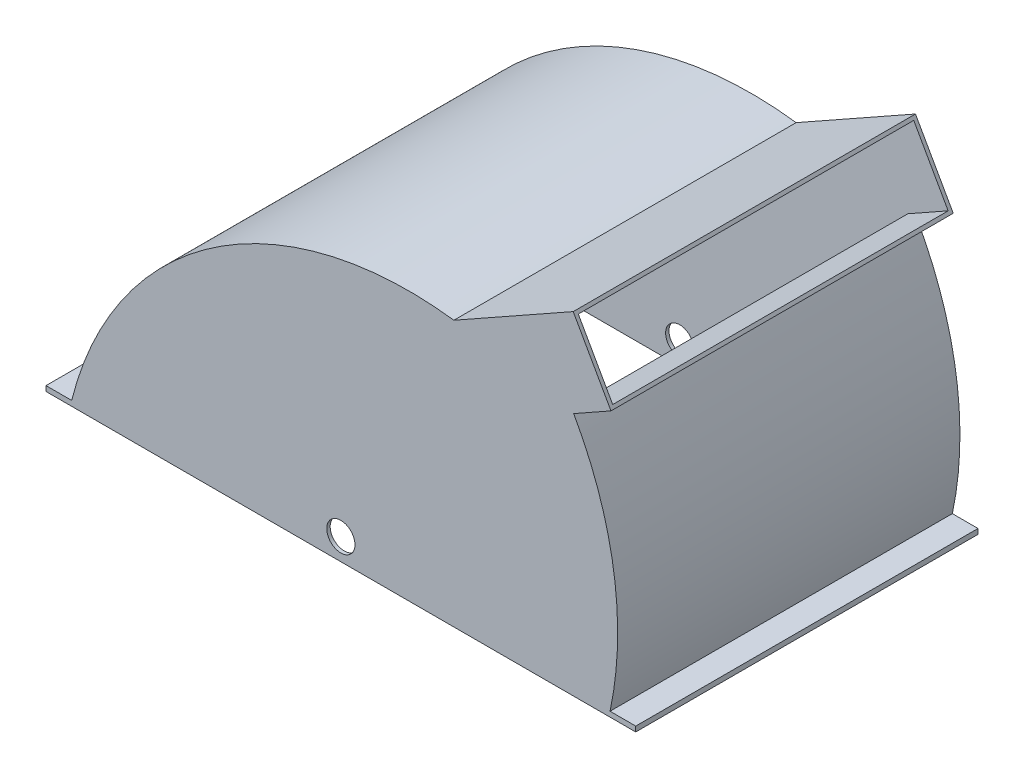
ISO-10303-21;
HEADER;
FILE_DESCRIPTION(('STEP AP214'),'2;1');
FILE_NAME('part.step','',(''),(''),'','','');
FILE_SCHEMA(('AUTOMOTIVE_DESIGN { 1 0 10303 214 1 1 1 1 }'));
ENDSEC;
DATA;
#1=APPLICATION_CONTEXT('core data for automotive mechanical design processes');
#2=APPLICATION_PROTOCOL_DEFINITION('international standard','automotive_design',2000,#1);
#3=PRODUCT_CONTEXT('',#1,'mechanical');
#4=PRODUCT('Part','Part','',(#3));
#5=PRODUCT_RELATED_PRODUCT_CATEGORY('part','',(#4));
#6=PRODUCT_DEFINITION_FORMATION('','',#4);
#7=PRODUCT_DEFINITION_CONTEXT('part definition',#1,'design');
#8=PRODUCT_DEFINITION('design','',#6,#7);
#9=PRODUCT_DEFINITION_SHAPE('','',#8);
#10=(LENGTH_UNIT() NAMED_UNIT(*) SI_UNIT(.MILLI.,.METRE.));
#11=(NAMED_UNIT(*) PLANE_ANGLE_UNIT() SI_UNIT($,.RADIAN.));
#12=(NAMED_UNIT(*) SI_UNIT($,.STERADIAN.) SOLID_ANGLE_UNIT());
#13=UNCERTAINTY_MEASURE_WITH_UNIT(LENGTH_MEASURE(1.E-05),#10,'distance_accuracy_value','');
#14=(GEOMETRIC_REPRESENTATION_CONTEXT(3) GLOBAL_UNCERTAINTY_ASSIGNED_CONTEXT((#13)) GLOBAL_UNIT_ASSIGNED_CONTEXT((#10,
#11,#12)) REPRESENTATION_CONTEXT('',''));
#15=CARTESIAN_POINT('',(0.,0.,0.));
#16=DIRECTION('',(0.,0.,1.));
#17=DIRECTION('',(1.,0.,0.));
#18=AXIS2_PLACEMENT_3D('',#15,#16,#17);
#19=CARTESIAN_POINT('',(39.841724248667,-49.2583214954355,98.));
#20=DIRECTION('',(0.,0.,1.));
#21=DIRECTION('',(1.,0.,0.));
#22=AXIS2_PLACEMENT_3D('',#19,#20,#21);
#23=PLANE('',#22);
#24=CARTESIAN_POINT('',(6.07568708894432E-13,9.69266385878526,98.));
#25=DIRECTION('',(0.,0.,1.));
#26=DIRECTION('',(1.,0.,0.));
#27=AXIS2_PLACEMENT_3D('',#24,#25,#26);
#28=CIRCLE('',#27,8.25);
#29=CARTESIAN_POINT('',(8.25000000000061,9.69266385878526,98.));
#30=VERTEX_POINT('',#29);
#31=EDGE_CURVE('E311',#30,#30,#28,.T.);
#32=ORIENTED_EDGE('',*,*,#31,.T.);
#33=EDGE_LOOP('',(#32));
#34=FACE_BOUND('',#33,.T.);
#35=DIRECTION('',(0.,1.,0.));
#36=VECTOR('',#35,1.);
#37=CARTESIAN_POINT('',(154.809922153854,-199.611145441147,98.));
#38=LINE('',#37,#36);
#39=CARTESIAN_POINT('',(154.809922153854,-3.,98.));
#40=VERTEX_POINT('',#39);
#41=CARTESIAN_POINT('',(154.809922153854,-2.00000000000001,98.));
#42=VERTEX_POINT('',#41);
#43=EDGE_CURVE('E59',#40,#42,#38,.T.);
#44=ORIENTED_EDGE('',*,*,#43,.F.);
#45=DIRECTION('',(1.,0.,0.));
#46=VECTOR('',#45,1.);
#47=CARTESIAN_POINT('',(-172.3,-3.,98.));
#48=LINE('',#47,#46);
#49=CARTESIAN_POINT('',(-155.732003196408,-3.,98.));
#50=VERTEX_POINT('',#49);
#51=EDGE_CURVE('E191',#50,#40,#48,.T.);
#52=ORIENTED_EDGE('',*,*,#51,.F.);
#53=DIRECTION('',(0.,1.,0.));
#54=VECTOR('',#53,1.);
#55=CARTESIAN_POINT('',(-155.732003196408,-199.611145441146,98.));
#56=LINE('',#55,#54);
#57=CARTESIAN_POINT('',(-155.732003196408,-2.00000000000001,98.));
#58=VERTEX_POINT('',#57);
#59=EDGE_CURVE('E306',#50,#58,#56,.T.);
#60=ORIENTED_EDGE('',*,*,#59,.T.);
#61=CARTESIAN_POINT('',(39.841724248667,-49.2583214954355,98.));
#62=DIRECTION('',(0.,0.,1.));
#63=DIRECTION('',(1.,0.,0.));
#64=AXIS2_PLACEMENT_3D('',#61,#62,#63);
#65=CIRCLE('',#64,201.202464739691);
#66=CARTESIAN_POINT('',(66.4458023419847,150.177519932657,98.));
#67=VERTEX_POINT('',#66);
#68=EDGE_CURVE('E188',#67,#58,#65,.T.);
#69=ORIENTED_EDGE('',*,*,#68,.F.);
#70=DIRECTION('',(-0.871511919232912,-0.490374320937552,0.));
#71=VECTOR('',#70,1.);
#72=CARTESIAN_POINT('',(67.0267902565978,150.504424875451,98.));
#73=LINE('',#72,#71);
#74=CARTESIAN_POINT('',(136.747743795231,189.734370550455,98.));
#75=VERTEX_POINT('',#74);
#76=EDGE_CURVE('E193',#75,#67,#73,.T.);
#77=ORIENTED_EDGE('',*,*,#76,.F.);
#78=DIRECTION('',(0.490374320937552,-0.871511919232913,0.));
#79=VECTOR('',#78,1.);
#80=CARTESIAN_POINT('',(135.766995153356,191.477394388921,98.));
#81=LINE('',#80,#79);
#82=CARTESIAN_POINT('',(156.853090953671,154.002381861905,98.));
#83=VERTEX_POINT('',#82);
#84=EDGE_CURVE('E280',#75,#83,#81,.T.);
#85=ORIENTED_EDGE('',*,*,#84,.T.);
#86=DIRECTION('',(0.871511919232892,0.490374320937588,0.));
#87=VECTOR('',#86,1.);
#88=CARTESIAN_POINT('',(156.85309095367,154.002381861906,98.));
#89=LINE('',#88,#87);
#90=CARTESIAN_POINT('',(133.313465759124,140.757321794269,98.));
#91=VERTEX_POINT('',#90);
#92=EDGE_CURVE('E195',#91,#83,#89,.T.);
#93=ORIENTED_EDGE('',*,*,#92,.F.);
#94=CARTESIAN_POINT('',(-38.2563422318594,41.9251358124896,98.));
#95=DIRECTION('',(0.,0.,1.));
#96=DIRECTION('',(1.,0.,0.));
#97=AXIS2_PLACEMENT_3D('',#94,#95,#96);
#98=CIRCLE('',#97,198.);
#99=EDGE_CURVE('E187',#42,#91,#98,.T.);
#100=ORIENTED_EDGE('',*,*,#99,.F.);
#101=EDGE_LOOP('',(#44,#52,#60,#69,#77,#85,#93,#100));
#102=FACE_BOUND('',#101,.T.);
#103=ADVANCED_FACE('F35',(#34,#102),#23,.F.);
#104=CARTESIAN_POINT('',(39.841724248667,-49.2583214954355,-98.));
#105=DIRECTION('',(0.,0.,1.));
#106=DIRECTION('',(1.,0.,0.));
#107=AXIS2_PLACEMENT_3D('',#104,#105,#106);
#108=PLANE('',#107);
#109=CARTESIAN_POINT('',(6.07568708894432E-13,9.69266385878526,-98.));
#110=DIRECTION('',(0.,0.,1.));
#111=DIRECTION('',(1.,0.,0.));
#112=AXIS2_PLACEMENT_3D('',#109,#110,#111);
#113=CIRCLE('',#112,8.25);
#114=CARTESIAN_POINT('',(8.25000000000061,9.69266385878526,-98.));
#115=VERTEX_POINT('',#114);
#116=EDGE_CURVE('E315',#115,#115,#113,.T.);
#117=ORIENTED_EDGE('',*,*,#116,.F.);
#118=EDGE_LOOP('',(#117));
#119=FACE_BOUND('',#118,.T.);
#120=DIRECTION('',(1.,0.,0.));
#121=VECTOR('',#120,1.);
#122=CARTESIAN_POINT('',(-172.3,-3.,-98.));
#123=LINE('',#122,#121);
#124=CARTESIAN_POINT('',(-155.732003196408,-3.,-98.));
#125=VERTEX_POINT('',#124);
#126=CARTESIAN_POINT('',(154.809922153854,-3.,-98.));
#127=VERTEX_POINT('',#126);
#128=EDGE_CURVE('E51',#125,#127,#123,.T.);
#129=ORIENTED_EDGE('',*,*,#128,.T.);
#130=DIRECTION('',(0.,1.,0.));
#131=VECTOR('',#130,1.);
#132=CARTESIAN_POINT('',(154.809922153854,-199.611145441147,-98.));
#133=LINE('',#132,#131);
#134=CARTESIAN_POINT('',(154.809922153854,-2.00000000000017,-98.));
#135=VERTEX_POINT('',#134);
#136=EDGE_CURVE('E172',#127,#135,#133,.T.);
#137=ORIENTED_EDGE('',*,*,#136,.T.);
#138=CARTESIAN_POINT('',(-38.2563422318594,41.9251358124896,-98.));
#139=DIRECTION('',(0.,0.,1.));
#140=DIRECTION('',(1.,0.,0.));
#141=AXIS2_PLACEMENT_3D('',#138,#139,#140);
#142=CIRCLE('',#141,198.);
#143=CARTESIAN_POINT('',(133.313465759124,140.757321794269,-98.));
#144=VERTEX_POINT('',#143);
#145=EDGE_CURVE('E162',#135,#144,#142,.T.);
#146=ORIENTED_EDGE('',*,*,#145,.T.);
#147=DIRECTION('',(0.871511919232892,0.490374320937588,0.));
#148=VECTOR('',#147,1.);
#149=CARTESIAN_POINT('',(156.85309095367,154.002381861906,-98.));
#150=LINE('',#149,#148);
#151=CARTESIAN_POINT('',(156.853090953671,154.002381861905,-98.));
#152=VERTEX_POINT('',#151);
#153=EDGE_CURVE('E169',#144,#152,#150,.T.);
#154=ORIENTED_EDGE('',*,*,#153,.T.);
#155=DIRECTION('',(-0.490374320937552,0.871511919232913,0.));
#156=VECTOR('',#155,1.);
#157=CARTESIAN_POINT('',(135.766995153356,191.477394388921,-98.));
#158=LINE('',#157,#156);
#159=CARTESIAN_POINT('',(136.747743795231,189.734370550455,-98.));
#160=VERTEX_POINT('',#159);
#161=EDGE_CURVE('E11',#152,#160,#158,.T.);
#162=ORIENTED_EDGE('',*,*,#161,.T.);
#163=DIRECTION('',(-0.871511919232912,-0.490374320937552,0.));
#164=VECTOR('',#163,1.);
#165=CARTESIAN_POINT('',(67.0267902565978,150.504424875451,-98.));
#166=LINE('',#165,#164);
#167=CARTESIAN_POINT('',(66.4458023419847,150.177519932657,-98.));
#168=VERTEX_POINT('',#167);
#169=EDGE_CURVE('E192',#160,#168,#166,.T.);
#170=ORIENTED_EDGE('',*,*,#169,.T.);
#171=CARTESIAN_POINT('',(39.841724248667,-49.2583214954355,-98.));
#172=DIRECTION('',(0.,0.,1.));
#173=DIRECTION('',(1.,0.,0.));
#174=AXIS2_PLACEMENT_3D('',#171,#172,#173);
#175=CIRCLE('',#174,201.202464739691);
#176=CARTESIAN_POINT('',(-155.732003196408,-2.00000000000001,-98.));
#177=VERTEX_POINT('',#176);
#178=EDGE_CURVE('E196',#168,#177,#175,.T.);
#179=ORIENTED_EDGE('',*,*,#178,.T.);
#180=DIRECTION('',(0.,1.,0.));
#181=VECTOR('',#180,1.);
#182=CARTESIAN_POINT('',(-155.732003196408,-199.611145441146,-98.));
#183=LINE('',#182,#181);
#184=EDGE_CURVE('E303',#125,#177,#183,.T.);
#185=ORIENTED_EDGE('',*,*,#184,.F.);
#186=EDGE_LOOP('',(#129,#137,#146,#154,#162,#170,#179,#185));
#187=FACE_BOUND('',#186,.T.);
#188=ADVANCED_FACE('F173',(#119,#187),#108,.T.);
#189=CARTESIAN_POINT('',(-172.3,-3.,100.));
#190=DIRECTION('',(0.,1.,0.));
#191=DIRECTION('',(0.,0.,1.));
#192=AXIS2_PLACEMENT_3D('',#189,#190,#191);
#193=PLANE('',#192);
#194=DIRECTION('',(0.,0.,1.));
#195=VECTOR('',#194,1.);
#196=CARTESIAN_POINT('',(154.809922153854,-3.,98.));
#197=LINE('',#196,#195);
#198=EDGE_CURVE('E176',#127,#40,#197,.T.);
#199=ORIENTED_EDGE('',*,*,#198,.F.);
#200=ORIENTED_EDGE('',*,*,#128,.F.);
#201=DIRECTION('',(0.,0.,-1.));
#202=VECTOR('',#201,1.);
#203=CARTESIAN_POINT('',(-155.732003196408,-3.,-98.));
#204=LINE('',#203,#202);
#205=EDGE_CURVE('E198',#50,#125,#204,.T.);
#206=ORIENTED_EDGE('',*,*,#205,.F.);
#207=ORIENTED_EDGE('',*,*,#51,.T.);
#208=EDGE_LOOP('',(#199,#200,#206,#207));
#209=FACE_BOUND('',#208,.T.);
#210=DIRECTION('',(1.,0.,0.));
#211=VECTOR('',#210,1.);
#212=CARTESIAN_POINT('',(-172.3,-3.,-100.));
#213=LINE('',#212,#211);
#214=CARTESIAN_POINT('',(-172.3,-3.,-100.));
#215=VERTEX_POINT('',#214);
#216=CARTESIAN_POINT('',(172.3,-3.,-100.));
#217=VERTEX_POINT('',#216);
#218=EDGE_CURVE('E234',#215,#217,#213,.T.);
#219=ORIENTED_EDGE('',*,*,#218,.T.);
#220=DIRECTION('',(0.,0.,-1.));
#221=VECTOR('',#220,1.);
#222=CARTESIAN_POINT('',(172.3,-3.,100.));
#223=LINE('',#222,#221);
#224=CARTESIAN_POINT('',(172.3,-3.,100.));
#225=VERTEX_POINT('',#224);
#226=EDGE_CURVE('E264',#225,#217,#223,.T.);
#227=ORIENTED_EDGE('',*,*,#226,.F.);
#228=DIRECTION('',(1.,0.,0.));
#229=VECTOR('',#228,1.);
#230=CARTESIAN_POINT('',(-172.3,-3.,100.));
#231=LINE('',#230,#229);
#232=CARTESIAN_POINT('',(-172.3,-3.,100.));
#233=VERTEX_POINT('',#232);
#234=EDGE_CURVE('E213',#233,#225,#231,.T.);
#235=ORIENTED_EDGE('',*,*,#234,.F.);
#236=DIRECTION('',(0.,0.,-1.));
#237=VECTOR('',#236,1.);
#238=CARTESIAN_POINT('',(-172.3,-3.,100.));
#239=LINE('',#238,#237);
#240=EDGE_CURVE('E267',#233,#215,#239,.T.);
#241=ORIENTED_EDGE('',*,*,#240,.T.);
#242=EDGE_LOOP('',(#219,#227,#235,#241));
#243=FACE_BOUND('',#242,.T.);
#244=ADVANCED_FACE('F347',(#209,#243),#193,.F.);
#245=CARTESIAN_POINT('',(135.766995153356,191.477394388921,100.));
#246=DIRECTION('',(-0.871511919232912,-0.490374320937552,0.));
#247=DIRECTION('',(0.490374320937552,-0.871511919232913,0.));
#248=AXIS2_PLACEMENT_3D('',#245,#246,#247);
#249=PLANE('',#248);
#250=DIRECTION('',(-0.490374320937552,0.871511919232912,0.));
#251=VECTOR('',#250,1.);
#252=CARTESIAN_POINT('',(135.766995153356,191.477394388921,-100.));
#253=LINE('',#252,#251);
#254=CARTESIAN_POINT('',(157.833839595546,152.25935802344,-100.));
#255=VERTEX_POINT('',#254);
#256=CARTESIAN_POINT('',(135.766995153356,191.477394388921,-100.));
#257=VERTEX_POINT('',#256);
#258=EDGE_CURVE('E244',#255,#257,#253,.T.);
#259=ORIENTED_EDGE('',*,*,#258,.T.);
#260=DIRECTION('',(0.,0.,-1.));
#261=VECTOR('',#260,1.);
#262=CARTESIAN_POINT('',(135.766995153356,191.477394388921,100.));
#263=LINE('',#262,#261);
#264=CARTESIAN_POINT('',(135.766995153356,191.477394388921,100.));
#265=VERTEX_POINT('',#264);
#266=EDGE_CURVE('E249',#265,#257,#263,.T.);
#267=ORIENTED_EDGE('',*,*,#266,.F.);
#268=DIRECTION('',(-0.490374320937552,0.871511919232912,0.));
#269=VECTOR('',#268,1.);
#270=CARTESIAN_POINT('',(135.766995153356,191.477394388921,100.));
#271=LINE('',#270,#269);
#272=CARTESIAN_POINT('',(157.833839595546,152.25935802344,100.));
#273=VERTEX_POINT('',#272);
#274=EDGE_CURVE('E223',#273,#265,#271,.T.);
#275=ORIENTED_EDGE('',*,*,#274,.F.);
#276=DIRECTION('',(0.,0.,-1.));
#277=VECTOR('',#276,1.);
#278=CARTESIAN_POINT('',(157.833839595546,152.25935802344,100.));
#279=LINE('',#278,#277);
#280=EDGE_CURVE('E252',#273,#255,#279,.T.);
#281=ORIENTED_EDGE('',*,*,#280,.T.);
#282=EDGE_LOOP('',(#259,#267,#275,#281));
#283=FACE_BOUND('',#282,.T.);
#284=ORIENTED_EDGE('',*,*,#161,.F.);
#285=DIRECTION('',(0.,0.,-1.));
#286=VECTOR('',#285,1.);
#287=CARTESIAN_POINT('',(156.853090953671,154.002381861905,100.));
#288=LINE('',#287,#286);
#289=EDGE_CURVE('E276',#83,#152,#288,.T.);
#290=ORIENTED_EDGE('',*,*,#289,.F.);
#291=ORIENTED_EDGE('',*,*,#84,.F.);
#292=DIRECTION('',(0.,0.,1.));
#293=VECTOR('',#292,1.);
#294=CARTESIAN_POINT('',(136.747743795231,189.734370550455,100.));
#295=LINE('',#294,#293);
#296=EDGE_CURVE('E44',#160,#75,#295,.T.);
#297=ORIENTED_EDGE('',*,*,#296,.F.);
#298=EDGE_LOOP('',(#284,#290,#291,#297));
#299=FACE_BOUND('',#298,.T.);
#300=ADVANCED_FACE('F297',(#283,#299),#249,.F.);
#301=CARTESIAN_POINT('',(39.841724248667,-49.2583214954355,100.));
#302=DIRECTION('',(0.,0.,-1.));
#303=DIRECTION('',(-1.,0.,0.));
#304=AXIS2_PLACEMENT_3D('',#301,#302,#303);
#305=CYLINDRICAL_SURFACE('',#304,203.202464739691);
#306=CARTESIAN_POINT('',(39.841724248667,-49.2583214954355,-100.));
#307=DIRECTION('',(0.,0.,1.));
#308=DIRECTION('',(1.,0.,0.));
#309=AXIS2_PLACEMENT_3D('',#306,#307,#308);
#310=CIRCLE('',#309,203.202464739691);
#311=CARTESIAN_POINT('',(66.0460416147227,152.247448713917,-100.));
#312=VERTEX_POINT('',#311);
#313=CARTESIAN_POINT('',(-157.3,0.,-100.));
#314=VERTEX_POINT('',#313);
#315=EDGE_CURVE('E181',#312,#314,#310,.T.);
#316=ORIENTED_EDGE('',*,*,#315,.T.);
#317=DIRECTION('',(0.,0.,-1.));
#318=VECTOR('',#317,1.);
#319=CARTESIAN_POINT('',(-157.3,0.,100.));
#320=LINE('',#319,#318);
#321=CARTESIAN_POINT('',(-157.3,0.,100.));
#322=VERTEX_POINT('',#321);
#323=EDGE_CURVE('E273',#322,#314,#320,.T.);
#324=ORIENTED_EDGE('',*,*,#323,.F.);
#325=CARTESIAN_POINT('',(39.841724248667,-49.2583214954355,100.));
#326=DIRECTION('',(0.,0.,1.));
#327=DIRECTION('',(1.,0.,0.));
#328=AXIS2_PLACEMENT_3D('',#325,#326,#327);
#329=CIRCLE('',#328,203.202464739691);
#330=CARTESIAN_POINT('',(66.0460416147227,152.247448713917,100.));
#331=VERTEX_POINT('',#330);
#332=EDGE_CURVE('E205',#331,#322,#329,.T.);
#333=ORIENTED_EDGE('',*,*,#332,.F.);
#334=DIRECTION('',(0.,0.,-1.));
#335=VECTOR('',#334,1.);
#336=CARTESIAN_POINT('',(66.0460416147227,152.247448713917,100.));
#337=LINE('',#336,#335);
#338=EDGE_CURVE('E227',#331,#312,#337,.T.);
#339=ORIENTED_EDGE('',*,*,#338,.T.);
#340=EDGE_LOOP('',(#316,#324,#333,#339));
#341=FACE_BOUND('',#340,.T.);
#342=ADVANCED_FACE('F37',(#341),#305,.T.);
#343=CARTESIAN_POINT('',(-157.3,0.,100.));
#344=DIRECTION('',(0.,-1.,0.));
#345=DIRECTION('',(1.,0.,0.));
#346=AXIS2_PLACEMENT_3D('',#343,#344,#345);
#347=PLANE('',#346);
#348=DIRECTION('',(-1.,0.,0.));
#349=VECTOR('',#348,1.);
#350=CARTESIAN_POINT('',(-157.3,0.,-100.));
#351=LINE('',#350,#349);
#352=CARTESIAN_POINT('',(-172.3,0.,-100.));
#353=VERTEX_POINT('',#352);
#354=EDGE_CURVE('E230',#314,#353,#351,.T.);
#355=ORIENTED_EDGE('',*,*,#354,.T.);
#356=DIRECTION('',(0.,0.,-1.));
#357=VECTOR('',#356,1.);
#358=CARTESIAN_POINT('',(-172.3,0.,100.));
#359=LINE('',#358,#357);
#360=CARTESIAN_POINT('',(-172.3,0.,100.));
#361=VERTEX_POINT('',#360);
#362=EDGE_CURVE('E270',#361,#353,#359,.T.);
#363=ORIENTED_EDGE('',*,*,#362,.F.);
#364=DIRECTION('',(-1.,0.,0.));
#365=VECTOR('',#364,1.);
#366=CARTESIAN_POINT('',(-157.3,0.,100.));
#367=LINE('',#366,#365);
#368=EDGE_CURVE('E208',#322,#361,#367,.T.);
#369=ORIENTED_EDGE('',*,*,#368,.F.);
#370=ORIENTED_EDGE('',*,*,#323,.T.);
#371=EDGE_LOOP('',(#355,#363,#369,#370));
#372=FACE_BOUND('',#371,.T.);
#373=ADVANCED_FACE('F388',(#372),#347,.F.);
#374=CARTESIAN_POINT('',(-172.3,0.,100.));
#375=DIRECTION('',(1.,0.,0.));
#376=DIRECTION('',(0.,0.,-1.));
#377=AXIS2_PLACEMENT_3D('',#374,#375,#376);
#378=PLANE('',#377);
#379=DIRECTION('',(0.,-1.,0.));
#380=VECTOR('',#379,1.);
#381=CARTESIAN_POINT('',(-172.3,0.,-100.));
#382=LINE('',#381,#380);
#383=EDGE_CURVE('E232',#353,#215,#382,.T.);
#384=ORIENTED_EDGE('',*,*,#383,.T.);
#385=ORIENTED_EDGE('',*,*,#240,.F.);
#386=DIRECTION('',(0.,-1.,0.));
#387=VECTOR('',#386,1.);
#388=CARTESIAN_POINT('',(-172.3,0.,100.));
#389=LINE('',#388,#387);
#390=EDGE_CURVE('E211',#361,#233,#389,.T.);
#391=ORIENTED_EDGE('',*,*,#390,.F.);
#392=ORIENTED_EDGE('',*,*,#362,.T.);
#393=EDGE_LOOP('',(#384,#385,#391,#392));
#394=FACE_BOUND('',#393,.T.);
#395=ADVANCED_FACE('F382',(#394),#378,.F.);
#396=CARTESIAN_POINT('',(172.3,-3.,100.));
#397=DIRECTION('',(-1.,0.,0.));
#398=DIRECTION('',(0.,0.,1.));
#399=AXIS2_PLACEMENT_3D('',#396,#397,#398);
#400=PLANE('',#399);
#401=DIRECTION('',(0.,1.,0.));
#402=VECTOR('',#401,1.);
#403=CARTESIAN_POINT('',(172.3,-3.,-100.));
#404=LINE('',#403,#402);
#405=CARTESIAN_POINT('',(172.3,0.,-100.));
#406=VERTEX_POINT('',#405);
#407=EDGE_CURVE('E236',#217,#406,#404,.T.);
#408=ORIENTED_EDGE('',*,*,#407,.T.);
#409=DIRECTION('',(0.,0.,-1.));
#410=VECTOR('',#409,1.);
#411=CARTESIAN_POINT('',(172.3,0.,100.));
#412=LINE('',#411,#410);
#413=CARTESIAN_POINT('',(172.3,0.,100.));
#414=VERTEX_POINT('',#413);
#415=EDGE_CURVE('E261',#414,#406,#412,.T.);
#416=ORIENTED_EDGE('',*,*,#415,.F.);
#417=DIRECTION('',(0.,1.,0.));
#418=VECTOR('',#417,1.);
#419=CARTESIAN_POINT('',(172.3,-3.,100.));
#420=LINE('',#419,#418);
#421=EDGE_CURVE('E215',#225,#414,#420,.T.);
#422=ORIENTED_EDGE('',*,*,#421,.F.);
#423=ORIENTED_EDGE('',*,*,#226,.T.);
#424=EDGE_LOOP('',(#408,#416,#422,#423));
#425=FACE_BOUND('',#424,.T.);
#426=ADVANCED_FACE('F378',(#425),#400,.F.);
#427=CARTESIAN_POINT('',(157.3,0.,100.));
#428=DIRECTION('',(0.,-1.,0.));
#429=DIRECTION('',(1.,0.,0.));
#430=AXIS2_PLACEMENT_3D('',#427,#428,#429);
#431=PLANE('',#430);
#432=DIRECTION('',(-1.,0.,0.));
#433=VECTOR('',#432,1.);
#434=CARTESIAN_POINT('',(157.3,0.,-100.));
#435=LINE('',#434,#433);
#436=CARTESIAN_POINT('',(157.3,0.,-100.));
#437=VERTEX_POINT('',#436);
#438=EDGE_CURVE('E238',#406,#437,#435,.T.);
#439=ORIENTED_EDGE('',*,*,#438,.T.);
#440=DIRECTION('',(0.,0.,-1.));
#441=VECTOR('',#440,1.);
#442=CARTESIAN_POINT('',(157.3,0.,100.));
#443=LINE('',#442,#441);
#444=CARTESIAN_POINT('',(157.3,0.,100.));
#445=VERTEX_POINT('',#444);
#446=EDGE_CURVE('E258',#445,#437,#443,.T.);
#447=ORIENTED_EDGE('',*,*,#446,.F.);
#448=DIRECTION('',(-1.,0.,0.));
#449=VECTOR('',#448,1.);
#450=CARTESIAN_POINT('',(157.3,0.,100.));
#451=LINE('',#450,#449);
#452=EDGE_CURVE('E217',#414,#445,#451,.T.);
#453=ORIENTED_EDGE('',*,*,#452,.F.);
#454=ORIENTED_EDGE('',*,*,#415,.T.);
#455=EDGE_LOOP('',(#439,#447,#453,#454));
#456=FACE_BOUND('',#455,.T.);
#457=ADVANCED_FACE('F374',(#456),#431,.F.);
#458=CARTESIAN_POINT('',(-38.2563422318594,41.9251358124896,100.));
#459=DIRECTION('',(0.,0.,-1.));
#460=DIRECTION('',(-1.,0.,0.));
#461=AXIS2_PLACEMENT_3D('',#458,#459,#460);
#462=CYLINDRICAL_SURFACE('',#461,200.);
#463=CARTESIAN_POINT('',(-38.2563422318594,41.9251358124896,-100.));
#464=DIRECTION('',(0.,0.,1.));
#465=DIRECTION('',(-1.,0.,0.));
#466=AXIS2_PLACEMENT_3D('',#463,#464,#465);
#467=CIRCLE('',#466,200.);
#468=CARTESIAN_POINT('',(136.046041614723,140.,-100.));
#469=VERTEX_POINT('',#468);
#470=EDGE_CURVE('E240',#437,#469,#467,.T.);
#471=ORIENTED_EDGE('',*,*,#470,.T.);
#472=DIRECTION('',(0.,0.,-1.));
#473=VECTOR('',#472,1.);
#474=CARTESIAN_POINT('',(136.046041614723,140.,100.));
#475=LINE('',#474,#473);
#476=CARTESIAN_POINT('',(136.046041614723,140.,100.));
#477=VERTEX_POINT('',#476);
#478=EDGE_CURVE('E255',#477,#469,#475,.T.);
#479=ORIENTED_EDGE('',*,*,#478,.F.);
#480=CARTESIAN_POINT('',(-38.2563422318594,41.9251358124896,100.));
#481=DIRECTION('',(0.,0.,1.));
#482=DIRECTION('',(-1.,0.,0.));
#483=AXIS2_PLACEMENT_3D('',#480,#481,#482);
#484=CIRCLE('',#483,200.);
#485=EDGE_CURVE('E219',#445,#477,#484,.T.);
#486=ORIENTED_EDGE('',*,*,#485,.F.);
#487=ORIENTED_EDGE('',*,*,#446,.T.);
#488=EDGE_LOOP('',(#471,#479,#486,#487));
#489=FACE_BOUND('',#488,.T.);
#490=ADVANCED_FACE('F370',(#489),#462,.T.);
#491=CARTESIAN_POINT('',(157.833839595546,152.25935802344,100.));
#492=DIRECTION('',(-0.490374320937588,0.871511919232892,0.));
#493=DIRECTION('',(-0.871511919232892,-0.490374320937588,0.));
#494=AXIS2_PLACEMENT_3D('',#491,#492,#493);
#495=PLANE('',#494);
#496=DIRECTION('',(0.871511919232892,0.490374320937588,0.));
#497=VECTOR('',#496,1.);
#498=CARTESIAN_POINT('',(157.833839595546,152.25935802344,-100.));
#499=LINE('',#498,#497);
#500=EDGE_CURVE('E242',#469,#255,#499,.T.);
#501=ORIENTED_EDGE('',*,*,#500,.T.);
#502=ORIENTED_EDGE('',*,*,#280,.F.);
#503=DIRECTION('',(0.871511919232892,0.490374320937588,0.));
#504=VECTOR('',#503,1.);
#505=CARTESIAN_POINT('',(157.833839595546,152.25935802344,100.));
#506=LINE('',#505,#504);
#507=EDGE_CURVE('E221',#477,#273,#506,.T.);
#508=ORIENTED_EDGE('',*,*,#507,.F.);
#509=ORIENTED_EDGE('',*,*,#478,.T.);
#510=EDGE_LOOP('',(#501,#502,#508,#509));
#511=FACE_BOUND('',#510,.T.);
#512=ADVANCED_FACE('F363',(#511),#495,.F.);
#513=CARTESIAN_POINT('',(66.0460416147227,152.247448713917,100.));
#514=DIRECTION('',(0.490374320937552,-0.871511919232912,0.));
#515=DIRECTION('',(0.871511919232912,0.490374320937552,0.));
#516=AXIS2_PLACEMENT_3D('',#513,#514,#515);
#517=PLANE('',#516);
#518=DIRECTION('',(-0.871511919232912,-0.490374320937552,0.));
#519=VECTOR('',#518,1.);
#520=CARTESIAN_POINT('',(66.0460416147227,152.247448713917,-100.));
#521=LINE('',#520,#519);
#522=EDGE_CURVE('E209',#257,#312,#521,.T.);
#523=ORIENTED_EDGE('',*,*,#522,.T.);
#524=ORIENTED_EDGE('',*,*,#338,.F.);
#525=DIRECTION('',(-0.871511919232912,-0.490374320937552,0.));
#526=VECTOR('',#525,1.);
#527=CARTESIAN_POINT('',(66.0460416147227,152.247448713917,100.));
#528=LINE('',#527,#526);
#529=EDGE_CURVE('E225',#265,#331,#528,.T.);
#530=ORIENTED_EDGE('',*,*,#529,.F.);
#531=ORIENTED_EDGE('',*,*,#266,.T.);
#532=EDGE_LOOP('',(#523,#524,#530,#531));
#533=FACE_BOUND('',#532,.T.);
#534=ADVANCED_FACE('F356',(#533),#517,.F.);
#535=CARTESIAN_POINT('',(39.841724248667,-49.2583214954355,100.));
#536=DIRECTION('',(0.,0.,1.));
#537=DIRECTION('',(1.,0.,0.));
#538=AXIS2_PLACEMENT_3D('',#535,#536,#537);
#539=PLANE('',#538);
#540=CARTESIAN_POINT('',(6.07568708894432E-13,9.69266385878526,100.));
#541=DIRECTION('',(0.,0.,1.));
#542=DIRECTION('',(1.,0.,0.));
#543=AXIS2_PLACEMENT_3D('',#540,#541,#542);
#544=CIRCLE('',#543,8.25);
#545=CARTESIAN_POINT('',(8.25000000000061,9.69266385878526,100.));
#546=VERTEX_POINT('',#545);
#547=EDGE_CURVE('E318',#546,#546,#544,.T.);
#548=ORIENTED_EDGE('',*,*,#547,.F.);
#549=EDGE_LOOP('',(#548));
#550=FACE_BOUND('',#549,.T.);
#551=ORIENTED_EDGE('',*,*,#332,.T.);
#552=ORIENTED_EDGE('',*,*,#368,.T.);
#553=ORIENTED_EDGE('',*,*,#390,.T.);
#554=ORIENTED_EDGE('',*,*,#234,.T.);
#555=ORIENTED_EDGE('',*,*,#421,.T.);
#556=ORIENTED_EDGE('',*,*,#452,.T.);
#557=ORIENTED_EDGE('',*,*,#485,.T.);
#558=ORIENTED_EDGE('',*,*,#507,.T.);
#559=ORIENTED_EDGE('',*,*,#274,.T.);
#560=ORIENTED_EDGE('',*,*,#529,.T.);
#561=EDGE_LOOP('',(#551,#552,#553,#554,#555,#556,#557,#558,#559,#560));
#562=FACE_BOUND('',#561,.T.);
#563=ADVANCED_FACE('F353',(#550,#562),#539,.T.);
#564=CARTESIAN_POINT('',(39.841724248667,-49.2583214954355,-100.));
#565=DIRECTION('',(0.,0.,1.));
#566=DIRECTION('',(1.,0.,0.));
#567=AXIS2_PLACEMENT_3D('',#564,#565,#566);
#568=PLANE('',#567);
#569=CARTESIAN_POINT('',(6.07568708894432E-13,9.69266385878526,-100.));
#570=DIRECTION('',(0.,0.,1.));
#571=DIRECTION('',(1.,0.,0.));
#572=AXIS2_PLACEMENT_3D('',#569,#570,#571);
#573=CIRCLE('',#572,8.25);
#574=CARTESIAN_POINT('',(8.25000000000061,9.69266385878526,-100.));
#575=VERTEX_POINT('',#574);
#576=EDGE_CURVE('E321',#575,#575,#573,.T.);
#577=ORIENTED_EDGE('',*,*,#576,.T.);
#578=EDGE_LOOP('',(#577));
#579=FACE_BOUND('',#578,.T.);
#580=ORIENTED_EDGE('',*,*,#315,.F.);
#581=ORIENTED_EDGE('',*,*,#522,.F.);
#582=ORIENTED_EDGE('',*,*,#258,.F.);
#583=ORIENTED_EDGE('',*,*,#500,.F.);
#584=ORIENTED_EDGE('',*,*,#470,.F.);
#585=ORIENTED_EDGE('',*,*,#438,.F.);
#586=ORIENTED_EDGE('',*,*,#407,.F.);
#587=ORIENTED_EDGE('',*,*,#218,.F.);
#588=ORIENTED_EDGE('',*,*,#383,.F.);
#589=ORIENTED_EDGE('',*,*,#354,.F.);
#590=EDGE_LOOP('',(#580,#581,#582,#583,#584,#585,#586,#587,#588,#589));
#591=FACE_BOUND('',#590,.T.);
#592=ADVANCED_FACE('F325',(#579,#591),#568,.F.);
#593=CARTESIAN_POINT('',(39.841724248667,-49.2583214954355,100.));
#594=DIRECTION('',(0.,0.,-1.));
#595=DIRECTION('',(-1.,0.,0.));
#596=AXIS2_PLACEMENT_3D('',#593,#594,#595);
#597=CYLINDRICAL_SURFACE('',#596,201.202464739691);
#598=ORIENTED_EDGE('',*,*,#178,.F.);
#599=DIRECTION('',(0.,0.,-1.));
#600=VECTOR('',#599,1.);
#601=CARTESIAN_POINT('',(66.4458023419847,150.177519932657,98.));
#602=LINE('',#601,#600);
#603=EDGE_CURVE('E183',#67,#168,#602,.T.);
#604=ORIENTED_EDGE('',*,*,#603,.F.);
#605=ORIENTED_EDGE('',*,*,#68,.T.);
#606=DIRECTION('',(0.,0.,-1.));
#607=VECTOR('',#606,1.);
#608=CARTESIAN_POINT('',(-155.732003196408,-2.00000000000001,98.));
#609=LINE('',#608,#607);
#610=EDGE_CURVE('E179',#58,#177,#609,.T.);
#611=ORIENTED_EDGE('',*,*,#610,.T.);
#612=EDGE_LOOP('',(#598,#604,#605,#611));
#613=FACE_BOUND('',#612,.T.);
#614=ADVANCED_FACE('F360',(#613),#597,.F.);
#615=CARTESIAN_POINT('',(-38.2563422318594,41.9251358124896,100.));
#616=DIRECTION('',(0.,0.,-1.));
#617=DIRECTION('',(-1.,0.,0.));
#618=AXIS2_PLACEMENT_3D('',#615,#616,#617);
#619=CYLINDRICAL_SURFACE('',#618,198.);
#620=ORIENTED_EDGE('',*,*,#145,.F.);
#621=DIRECTION('',(0.,0.,-1.));
#622=VECTOR('',#621,1.);
#623=CARTESIAN_POINT('',(154.809922153854,-2.00000000000001,98.));
#624=LINE('',#623,#622);
#625=EDGE_CURVE('E165',#42,#135,#624,.T.);
#626=ORIENTED_EDGE('',*,*,#625,.F.);
#627=ORIENTED_EDGE('',*,*,#99,.T.);
#628=DIRECTION('',(0.,0.,-1.));
#629=VECTOR('',#628,1.);
#630=CARTESIAN_POINT('',(133.313465759124,140.757321794269,98.));
#631=LINE('',#630,#629);
#632=EDGE_CURVE('E167',#91,#144,#631,.T.);
#633=ORIENTED_EDGE('',*,*,#632,.T.);
#634=EDGE_LOOP('',(#620,#626,#627,#633));
#635=FACE_BOUND('',#634,.T.);
#636=ADVANCED_FACE('F163',(#635),#619,.F.);
#637=CARTESIAN_POINT('',(156.85309095367,154.002381861906,100.));
#638=DIRECTION('',(-0.490374320937588,0.871511919232892,0.));
#639=DIRECTION('',(-0.871511919232892,-0.490374320937588,0.));
#640=AXIS2_PLACEMENT_3D('',#637,#638,#639);
#641=PLANE('',#640);
#642=ORIENTED_EDGE('',*,*,#153,.F.);
#643=ORIENTED_EDGE('',*,*,#632,.F.);
#644=ORIENTED_EDGE('',*,*,#92,.T.);
#645=ORIENTED_EDGE('',*,*,#289,.T.);
#646=EDGE_LOOP('',(#642,#643,#644,#645));
#647=FACE_BOUND('',#646,.T.);
#648=ADVANCED_FACE('F299',(#647),#641,.T.);
#649=CARTESIAN_POINT('',(67.0267902565978,150.504424875451,100.));
#650=DIRECTION('',(0.490374320937552,-0.871511919232912,0.));
#651=DIRECTION('',(0.871511919232912,0.490374320937552,0.));
#652=AXIS2_PLACEMENT_3D('',#649,#650,#651);
#653=PLANE('',#652);
#654=ORIENTED_EDGE('',*,*,#169,.F.);
#655=ORIENTED_EDGE('',*,*,#296,.T.);
#656=ORIENTED_EDGE('',*,*,#76,.T.);
#657=ORIENTED_EDGE('',*,*,#603,.T.);
#658=EDGE_LOOP('',(#654,#655,#656,#657));
#659=FACE_BOUND('',#658,.T.);
#660=ADVANCED_FACE('F289',(#659),#653,.T.);
#661=CARTESIAN_POINT('',(-155.732003196408,-199.611145441146,-98.));
#662=DIRECTION('',(-1.,0.,0.));
#663=DIRECTION('',(0.,-1.,0.));
#664=AXIS2_PLACEMENT_3D('',#661,#662,#663);
#665=PLANE('',#664);
#666=ORIENTED_EDGE('',*,*,#59,.F.);
#667=ORIENTED_EDGE('',*,*,#205,.T.);
#668=ORIENTED_EDGE('',*,*,#184,.T.);
#669=ORIENTED_EDGE('',*,*,#610,.F.);
#670=EDGE_LOOP('',(#666,#667,#668,#669));
#671=FACE_BOUND('',#670,.T.);
#672=ADVANCED_FACE('F338',(#671),#665,.F.);
#673=CARTESIAN_POINT('',(154.809922153854,-199.611145441147,98.));
#674=DIRECTION('',(1.,0.,0.));
#675=DIRECTION('',(0.,1.,0.));
#676=AXIS2_PLACEMENT_3D('',#673,#674,#675);
#677=PLANE('',#676);
#678=ORIENTED_EDGE('',*,*,#136,.F.);
#679=ORIENTED_EDGE('',*,*,#198,.T.);
#680=ORIENTED_EDGE('',*,*,#43,.T.);
#681=ORIENTED_EDGE('',*,*,#625,.T.);
#682=EDGE_LOOP('',(#678,#679,#680,#681));
#683=FACE_BOUND('',#682,.T.);
#684=ADVANCED_FACE('F178',(#683),#677,.F.);
#685=CARTESIAN_POINT('',(6.07568708894432E-13,9.69266385878526,-100.));
#686=DIRECTION('',(0.,0.,1.));
#687=DIRECTION('',(1.,0.,0.));
#688=AXIS2_PLACEMENT_3D('',#685,#686,#687);
#689=CYLINDRICAL_SURFACE('',#688,8.25);
#690=ORIENTED_EDGE('',*,*,#116,.T.);
#691=EDGE_LOOP('',(#690));
#692=FACE_BOUND('',#691,.T.);
#693=ORIENTED_EDGE('',*,*,#576,.F.);
#694=EDGE_LOOP('',(#693));
#695=FACE_BOUND('',#694,.T.);
#696=ADVANCED_FACE('F328',(#692,#695),#689,.F.);
#697=ORIENTED_EDGE('',*,*,#547,.T.);
#698=EDGE_LOOP('',(#697));
#699=FACE_BOUND('',#698,.T.);
#700=ORIENTED_EDGE('',*,*,#31,.F.);
#701=EDGE_LOOP('',(#700));
#702=FACE_BOUND('',#701,.T.);
#703=ADVANCED_FACE('F330',(#699,#702),#689,.F.);
#704=CLOSED_SHELL('',(#103,#188,#244,#300,#342,#373,#395,#426,#457,#490,#512,#534,#563,#592,
#614,#636,#648,#660,#672,#684,#696,#703));
#705=MANIFOLD_SOLID_BREP('B2',#704);
#706=ADVANCED_BREP_SHAPE_REPRESENTATION('',(#18,#705),#14);
#707=SHAPE_DEFINITION_REPRESENTATION(#9,#706);
ENDSEC;
END-ISO-10303-21;
